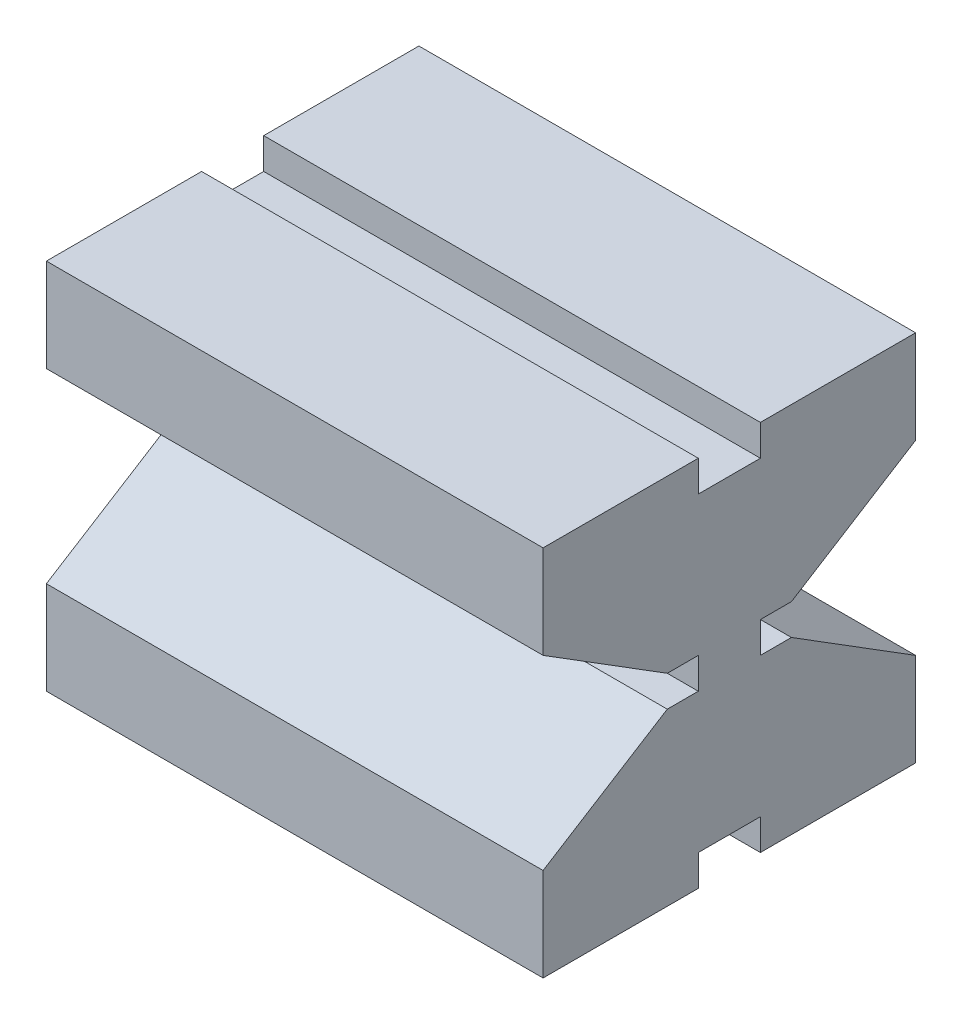
ISO-10303-21;
HEADER;
FILE_DESCRIPTION(('STEP AP214'),'2;1');
FILE_NAME('part.step','',(''),(''),'','','');
FILE_SCHEMA(('AUTOMOTIVE_DESIGN { 1 0 10303 214 1 1 1 1 }'));
ENDSEC;
DATA;
#1=APPLICATION_CONTEXT('core data for automotive mechanical design processes');
#2=APPLICATION_PROTOCOL_DEFINITION('international standard','automotive_design',2000,#1);
#3=PRODUCT_CONTEXT('',#1,'mechanical');
#4=PRODUCT('Part','Part','',(#3));
#5=PRODUCT_RELATED_PRODUCT_CATEGORY('part','',(#4));
#6=PRODUCT_DEFINITION_FORMATION('','',#4);
#7=PRODUCT_DEFINITION_CONTEXT('part definition',#1,'design');
#8=PRODUCT_DEFINITION('design','',#6,#7);
#9=PRODUCT_DEFINITION_SHAPE('','',#8);
#10=(LENGTH_UNIT() NAMED_UNIT(*) SI_UNIT(.MILLI.,.METRE.));
#11=(NAMED_UNIT(*) PLANE_ANGLE_UNIT() SI_UNIT($,.RADIAN.));
#12=(NAMED_UNIT(*) SI_UNIT($,.STERADIAN.) SOLID_ANGLE_UNIT());
#13=UNCERTAINTY_MEASURE_WITH_UNIT(LENGTH_MEASURE(1.E-05),#10,'distance_accuracy_value','');
#14=(GEOMETRIC_REPRESENTATION_CONTEXT(3) GLOBAL_UNCERTAINTY_ASSIGNED_CONTEXT((#13)) GLOBAL_UNIT_ASSIGNED_CONTEXT((#10,
#11,#12)) REPRESENTATION_CONTEXT('',''));
#15=CARTESIAN_POINT('',(0.,0.,0.));
#16=DIRECTION('',(0.,0.,1.));
#17=DIRECTION('',(1.,0.,0.));
#18=AXIS2_PLACEMENT_3D('',#15,#16,#17);
#19=CARTESIAN_POINT('',(-40.,-30.,30.));
#20=DIRECTION('',(0.,-1.,0.));
#21=DIRECTION('',(0.,0.,-1.));
#22=AXIS2_PLACEMENT_3D('',#19,#20,#21);
#23=PLANE('',#22);
#24=DIRECTION('',(0.,0.,-1.));
#25=VECTOR('',#24,1.);
#26=CARTESIAN_POINT('',(40.,-30.,30.));
#27=LINE('',#26,#25);
#28=CARTESIAN_POINT('',(40.,-30.,30.));
#29=VERTEX_POINT('',#28);
#30=CARTESIAN_POINT('',(40.,-30.,5.));
#31=VERTEX_POINT('',#30);
#32=EDGE_CURVE('E232',#29,#31,#27,.T.);
#33=ORIENTED_EDGE('',*,*,#32,.F.);
#34=DIRECTION('',(1.,0.,0.));
#35=VECTOR('',#34,1.);
#36=CARTESIAN_POINT('',(-40.,-30.,30.));
#37=LINE('',#36,#35);
#38=CARTESIAN_POINT('',(-40.,-30.,30.));
#39=VERTEX_POINT('',#38);
#40=EDGE_CURVE('E11',#39,#29,#37,.T.);
#41=ORIENTED_EDGE('',*,*,#40,.F.);
#42=DIRECTION('',(0.,0.,-1.));
#43=VECTOR('',#42,1.);
#44=CARTESIAN_POINT('',(-40.,-30.,30.));
#45=LINE('',#44,#43);
#46=CARTESIAN_POINT('',(-40.,-30.,5.));
#47=VERTEX_POINT('',#46);
#48=EDGE_CURVE('E300',#39,#47,#45,.T.);
#49=ORIENTED_EDGE('',*,*,#48,.T.);
#50=DIRECTION('',(1.,0.,0.));
#51=VECTOR('',#50,1.);
#52=CARTESIAN_POINT('',(-40.,-30.,5.));
#53=LINE('',#52,#51);
#54=EDGE_CURVE('E42',#47,#31,#53,.T.);
#55=ORIENTED_EDGE('',*,*,#54,.T.);
#56=EDGE_LOOP('',(#33,#41,#49,#55));
#57=FACE_BOUND('',#56,.T.);
#58=ADVANCED_FACE('F39',(#57),#23,.T.);
#59=CARTESIAN_POINT('',(-40.,-30.,30.));
#60=DIRECTION('',(0.,0.,1.));
#61=DIRECTION('',(1.,0.,0.));
#62=AXIS2_PLACEMENT_3D('',#59,#60,#61);
#63=PLANE('',#62);
#64=DIRECTION('',(0.,-1.,0.));
#65=VECTOR('',#64,1.);
#66=CARTESIAN_POINT('',(40.,-30.,30.));
#67=LINE('',#66,#65);
#68=CARTESIAN_POINT('',(40.,-15.,30.));
#69=VERTEX_POINT('',#68);
#70=EDGE_CURVE('E298',#69,#29,#67,.T.);
#71=ORIENTED_EDGE('',*,*,#70,.F.);
#72=DIRECTION('',(1.,0.,0.));
#73=VECTOR('',#72,1.);
#74=CARTESIAN_POINT('',(-40.,-15.,30.));
#75=LINE('',#74,#73);
#76=CARTESIAN_POINT('',(-40.,-15.,30.));
#77=VERTEX_POINT('',#76);
#78=EDGE_CURVE('E48',#77,#69,#75,.T.);
#79=ORIENTED_EDGE('',*,*,#78,.F.);
#80=DIRECTION('',(0.,-1.,0.));
#81=VECTOR('',#80,1.);
#82=CARTESIAN_POINT('',(-40.,-30.,30.));
#83=LINE('',#82,#81);
#84=EDGE_CURVE('E222',#77,#39,#83,.T.);
#85=ORIENTED_EDGE('',*,*,#84,.T.);
#86=ORIENTED_EDGE('',*,*,#40,.T.);
#87=EDGE_LOOP('',(#71,#79,#85,#86));
#88=FACE_BOUND('',#87,.T.);
#89=ADVANCED_FACE('F344',(#88),#63,.T.);
#90=CARTESIAN_POINT('',(-40.,-15.,30.));
#91=DIRECTION('',(0.,0.847998304005088,0.52999894000318));
#92=DIRECTION('',(0.,-0.52999894000318,0.847998304005088));
#93=AXIS2_PLACEMENT_3D('',#90,#91,#92);
#94=PLANE('',#93);
#95=DIRECTION('',(0.,-0.52999894000318,0.847998304005088));
#96=VECTOR('',#95,1.);
#97=CARTESIAN_POINT('',(40.,-15.,30.));
#98=LINE('',#97,#96);
#99=CARTESIAN_POINT('',(40.,-2.49999999999999,10.));
#100=VERTEX_POINT('',#99);
#101=EDGE_CURVE('E209',#100,#69,#98,.T.);
#102=ORIENTED_EDGE('',*,*,#101,.F.);
#103=DIRECTION('',(1.,0.,0.));
#104=VECTOR('',#103,1.);
#105=CARTESIAN_POINT('',(-40.,-2.49999999999999,10.));
#106=LINE('',#105,#104);
#107=CARTESIAN_POINT('',(-40.,-2.49999999999999,10.));
#108=VERTEX_POINT('',#107);
#109=EDGE_CURVE('E204',#108,#100,#106,.T.);
#110=ORIENTED_EDGE('',*,*,#109,.F.);
#111=DIRECTION('',(0.,-0.52999894000318,0.847998304005088));
#112=VECTOR('',#111,1.);
#113=CARTESIAN_POINT('',(-40.,-15.,30.));
#114=LINE('',#113,#112);
#115=EDGE_CURVE('E207',#108,#77,#114,.T.);
#116=ORIENTED_EDGE('',*,*,#115,.T.);
#117=ORIENTED_EDGE('',*,*,#78,.T.);
#118=EDGE_LOOP('',(#102,#110,#116,#117));
#119=FACE_BOUND('',#118,.T.);
#120=ADVANCED_FACE('F206',(#119),#94,.T.);
#121=CARTESIAN_POINT('',(-40.,-2.49999999999999,10.));
#122=DIRECTION('',(0.,1.,0.));
#123=DIRECTION('',(0.,0.,1.));
#124=AXIS2_PLACEMENT_3D('',#121,#122,#123);
#125=PLANE('',#124);
#126=DIRECTION('',(0.,0.,1.));
#127=VECTOR('',#126,1.);
#128=CARTESIAN_POINT('',(40.,-2.49999999999999,10.));
#129=LINE('',#128,#127);
#130=CARTESIAN_POINT('',(40.,-2.49999999999999,5.));
#131=VERTEX_POINT('',#130);
#132=EDGE_CURVE('E295',#131,#100,#129,.T.);
#133=ORIENTED_EDGE('',*,*,#132,.F.);
#134=DIRECTION('',(1.,0.,0.));
#135=VECTOR('',#134,1.);
#136=CARTESIAN_POINT('',(-40.,-2.49999999999999,5.));
#137=LINE('',#136,#135);
#138=CARTESIAN_POINT('',(-40.,-2.49999999999999,5.));
#139=VERTEX_POINT('',#138);
#140=EDGE_CURVE('E214',#139,#131,#137,.T.);
#141=ORIENTED_EDGE('',*,*,#140,.F.);
#142=DIRECTION('',(0.,0.,1.));
#143=VECTOR('',#142,1.);
#144=CARTESIAN_POINT('',(-40.,-2.49999999999999,10.));
#145=LINE('',#144,#143);
#146=EDGE_CURVE('E220',#139,#108,#145,.T.);
#147=ORIENTED_EDGE('',*,*,#146,.T.);
#148=ORIENTED_EDGE('',*,*,#109,.T.);
#149=EDGE_LOOP('',(#133,#141,#147,#148));
#150=FACE_BOUND('',#149,.T.);
#151=ADVANCED_FACE('F224',(#150),#125,.T.);
#152=CARTESIAN_POINT('',(-40.,-2.49999999999999,5.));
#153=DIRECTION('',(0.,0.,1.));
#154=DIRECTION('',(0.,-1.,0.));
#155=AXIS2_PLACEMENT_3D('',#152,#153,#154);
#156=PLANE('',#155);
#157=DIRECTION('',(0.,-1.,0.));
#158=VECTOR('',#157,1.);
#159=CARTESIAN_POINT('',(40.,-2.49999999999999,5.));
#160=LINE('',#159,#158);
#161=CARTESIAN_POINT('',(40.,2.50000000000001,5.));
#162=VERTEX_POINT('',#161);
#163=EDGE_CURVE('E292',#162,#131,#160,.T.);
#164=ORIENTED_EDGE('',*,*,#163,.F.);
#165=DIRECTION('',(1.,0.,0.));
#166=VECTOR('',#165,1.);
#167=CARTESIAN_POINT('',(-40.,2.50000000000001,5.));
#168=LINE('',#167,#166);
#169=CARTESIAN_POINT('',(-40.,2.50000000000001,5.));
#170=VERTEX_POINT('',#169);
#171=EDGE_CURVE('E304',#170,#162,#168,.T.);
#172=ORIENTED_EDGE('',*,*,#171,.F.);
#173=DIRECTION('',(0.,-1.,0.));
#174=VECTOR('',#173,1.);
#175=CARTESIAN_POINT('',(-40.,-2.49999999999999,5.));
#176=LINE('',#175,#174);
#177=EDGE_CURVE('E225',#170,#139,#176,.T.);
#178=ORIENTED_EDGE('',*,*,#177,.T.);
#179=ORIENTED_EDGE('',*,*,#140,.T.);
#180=EDGE_LOOP('',(#164,#172,#178,#179));
#181=FACE_BOUND('',#180,.T.);
#182=ADVANCED_FACE('F357',(#181),#156,.T.);
#183=CARTESIAN_POINT('',(-40.,2.50000000000001,10.));
#184=DIRECTION('',(0.,-1.,0.));
#185=DIRECTION('',(0.,0.,-1.));
#186=AXIS2_PLACEMENT_3D('',#183,#184,#185);
#187=PLANE('',#186);
#188=DIRECTION('',(0.,0.,-1.));
#189=VECTOR('',#188,1.);
#190=CARTESIAN_POINT('',(40.,2.50000000000001,10.));
#191=LINE('',#190,#189);
#192=CARTESIAN_POINT('',(40.,2.50000000000001,10.));
#193=VERTEX_POINT('',#192);
#194=EDGE_CURVE('E289',#193,#162,#191,.T.);
#195=ORIENTED_EDGE('',*,*,#194,.F.);
#196=DIRECTION('',(1.,0.,0.));
#197=VECTOR('',#196,1.);
#198=CARTESIAN_POINT('',(-40.,2.50000000000001,10.));
#199=LINE('',#198,#197);
#200=CARTESIAN_POINT('',(-40.,2.50000000000001,10.));
#201=VERTEX_POINT('',#200);
#202=EDGE_CURVE('E306',#201,#193,#199,.T.);
#203=ORIENTED_EDGE('',*,*,#202,.F.);
#204=DIRECTION('',(0.,0.,-1.));
#205=VECTOR('',#204,1.);
#206=CARTESIAN_POINT('',(-40.,2.50000000000001,10.));
#207=LINE('',#206,#205);
#208=EDGE_CURVE('E227',#201,#170,#207,.T.);
#209=ORIENTED_EDGE('',*,*,#208,.T.);
#210=ORIENTED_EDGE('',*,*,#171,.T.);
#211=EDGE_LOOP('',(#195,#203,#209,#210));
#212=FACE_BOUND('',#211,.T.);
#213=ADVANCED_FACE('F360',(#212),#187,.T.);
#214=CARTESIAN_POINT('',(-40.,15.,30.));
#215=DIRECTION('',(0.,-0.847998304005088,0.52999894000318));
#216=DIRECTION('',(0.,-0.52999894000318,-0.847998304005088));
#217=AXIS2_PLACEMENT_3D('',#214,#215,#216);
#218=PLANE('',#217);
#219=DIRECTION('',(0.,-0.52999894000318,-0.847998304005088));
#220=VECTOR('',#219,1.);
#221=CARTESIAN_POINT('',(40.,15.,30.));
#222=LINE('',#221,#220);
#223=CARTESIAN_POINT('',(40.,15.,30.));
#224=VERTEX_POINT('',#223);
#225=EDGE_CURVE('E286',#224,#193,#222,.T.);
#226=ORIENTED_EDGE('',*,*,#225,.F.);
#227=DIRECTION('',(1.,0.,0.));
#228=VECTOR('',#227,1.);
#229=CARTESIAN_POINT('',(-40.,15.,30.));
#230=LINE('',#229,#228);
#231=CARTESIAN_POINT('',(-40.,15.,30.));
#232=VERTEX_POINT('',#231);
#233=EDGE_CURVE('E308',#232,#224,#230,.T.);
#234=ORIENTED_EDGE('',*,*,#233,.F.);
#235=DIRECTION('',(0.,-0.52999894000318,-0.847998304005088));
#236=VECTOR('',#235,1.);
#237=CARTESIAN_POINT('',(-40.,15.,30.));
#238=LINE('',#237,#236);
#239=EDGE_CURVE('E650',#232,#201,#238,.T.);
#240=ORIENTED_EDGE('',*,*,#239,.T.);
#241=ORIENTED_EDGE('',*,*,#202,.T.);
#242=EDGE_LOOP('',(#226,#234,#240,#241));
#243=FACE_BOUND('',#242,.T.);
#244=ADVANCED_FACE('F364',(#243),#218,.T.);
#245=CARTESIAN_POINT('',(-40.,30.,30.));
#246=DIRECTION('',(0.,0.,1.));
#247=DIRECTION('',(0.,-1.,0.));
#248=AXIS2_PLACEMENT_3D('',#245,#246,#247);
#249=PLANE('',#248);
#250=DIRECTION('',(0.,-1.,0.));
#251=VECTOR('',#250,1.);
#252=CARTESIAN_POINT('',(40.,30.,30.));
#253=LINE('',#252,#251);
#254=CARTESIAN_POINT('',(40.,30.,30.));
#255=VERTEX_POINT('',#254);
#256=EDGE_CURVE('E283',#255,#224,#253,.T.);
#257=ORIENTED_EDGE('',*,*,#256,.F.);
#258=DIRECTION('',(1.,0.,0.));
#259=VECTOR('',#258,1.);
#260=CARTESIAN_POINT('',(-40.,30.,30.));
#261=LINE('',#260,#259);
#262=CARTESIAN_POINT('',(-40.,30.,30.));
#263=VERTEX_POINT('',#262);
#264=EDGE_CURVE('E310',#263,#255,#261,.T.);
#265=ORIENTED_EDGE('',*,*,#264,.F.);
#266=DIRECTION('',(0.,-1.,0.));
#267=VECTOR('',#266,1.);
#268=CARTESIAN_POINT('',(-40.,30.,30.));
#269=LINE('',#268,#267);
#270=EDGE_CURVE('E654',#263,#232,#269,.T.);
#271=ORIENTED_EDGE('',*,*,#270,.T.);
#272=ORIENTED_EDGE('',*,*,#233,.T.);
#273=EDGE_LOOP('',(#257,#265,#271,#272));
#274=FACE_BOUND('',#273,.T.);
#275=ADVANCED_FACE('F368',(#274),#249,.T.);
#276=CARTESIAN_POINT('',(-40.,30.,30.));
#277=DIRECTION('',(0.,1.,0.));
#278=DIRECTION('',(0.,0.,1.));
#279=AXIS2_PLACEMENT_3D('',#276,#277,#278);
#280=PLANE('',#279);
#281=DIRECTION('',(0.,0.,1.));
#282=VECTOR('',#281,1.);
#283=CARTESIAN_POINT('',(40.,30.,30.));
#284=LINE('',#283,#282);
#285=CARTESIAN_POINT('',(40.,30.,5.));
#286=VERTEX_POINT('',#285);
#287=EDGE_CURVE('E280',#286,#255,#284,.T.);
#288=ORIENTED_EDGE('',*,*,#287,.F.);
#289=DIRECTION('',(1.,0.,0.));
#290=VECTOR('',#289,1.);
#291=CARTESIAN_POINT('',(-40.,30.,5.));
#292=LINE('',#291,#290);
#293=CARTESIAN_POINT('',(-40.,30.,5.));
#294=VERTEX_POINT('',#293);
#295=EDGE_CURVE('E312',#294,#286,#292,.T.);
#296=ORIENTED_EDGE('',*,*,#295,.F.);
#297=DIRECTION('',(0.,0.,1.));
#298=VECTOR('',#297,1.);
#299=CARTESIAN_POINT('',(-40.,30.,30.));
#300=LINE('',#299,#298);
#301=EDGE_CURVE('E643',#294,#263,#300,.T.);
#302=ORIENTED_EDGE('',*,*,#301,.T.);
#303=ORIENTED_EDGE('',*,*,#264,.T.);
#304=EDGE_LOOP('',(#288,#296,#302,#303));
#305=FACE_BOUND('',#304,.T.);
#306=ADVANCED_FACE('F372',(#305),#280,.T.);
#307=CARTESIAN_POINT('',(-40.,30.,5.));
#308=DIRECTION('',(0.,0.,-1.));
#309=DIRECTION('',(0.,1.,0.));
#310=AXIS2_PLACEMENT_3D('',#307,#308,#309);
#311=PLANE('',#310);
#312=DIRECTION('',(0.,1.,0.));
#313=VECTOR('',#312,1.);
#314=CARTESIAN_POINT('',(40.,30.,5.));
#315=LINE('',#314,#313);
#316=CARTESIAN_POINT('',(40.,25.,5.00000000000001));
#317=VERTEX_POINT('',#316);
#318=EDGE_CURVE('E277',#317,#286,#315,.T.);
#319=ORIENTED_EDGE('',*,*,#318,.F.);
#320=DIRECTION('',(1.,0.,0.));
#321=VECTOR('',#320,1.);
#322=CARTESIAN_POINT('',(-40.,25.,5.00000000000001));
#323=LINE('',#322,#321);
#324=CARTESIAN_POINT('',(-40.,25.,5.00000000000001));
#325=VERTEX_POINT('',#324);
#326=EDGE_CURVE('E314',#325,#317,#323,.T.);
#327=ORIENTED_EDGE('',*,*,#326,.F.);
#328=DIRECTION('',(0.,1.,0.));
#329=VECTOR('',#328,1.);
#330=CARTESIAN_POINT('',(-40.,30.,5.));
#331=LINE('',#330,#329);
#332=EDGE_CURVE('E639',#325,#294,#331,.T.);
#333=ORIENTED_EDGE('',*,*,#332,.T.);
#334=ORIENTED_EDGE('',*,*,#295,.T.);
#335=EDGE_LOOP('',(#319,#327,#333,#334));
#336=FACE_BOUND('',#335,.T.);
#337=ADVANCED_FACE('F376',(#336),#311,.T.);
#338=CARTESIAN_POINT('',(-40.,25.,5.00000000000001));
#339=DIRECTION('',(0.,1.,0.));
#340=DIRECTION('',(0.,0.,1.));
#341=AXIS2_PLACEMENT_3D('',#338,#339,#340);
#342=PLANE('',#341);
#343=DIRECTION('',(0.,0.,1.));
#344=VECTOR('',#343,1.);
#345=CARTESIAN_POINT('',(40.,25.,5.00000000000001));
#346=LINE('',#345,#344);
#347=CARTESIAN_POINT('',(40.,25.,-4.99999999999999));
#348=VERTEX_POINT('',#347);
#349=EDGE_CURVE('E274',#348,#317,#346,.T.);
#350=ORIENTED_EDGE('',*,*,#349,.F.);
#351=DIRECTION('',(1.,0.,0.));
#352=VECTOR('',#351,1.);
#353=CARTESIAN_POINT('',(-40.,25.,-4.99999999999999));
#354=LINE('',#353,#352);
#355=CARTESIAN_POINT('',(-40.,25.,-4.99999999999999));
#356=VERTEX_POINT('',#355);
#357=EDGE_CURVE('E316',#356,#348,#354,.T.);
#358=ORIENTED_EDGE('',*,*,#357,.F.);
#359=DIRECTION('',(0.,0.,1.));
#360=VECTOR('',#359,1.);
#361=CARTESIAN_POINT('',(-40.,25.,5.00000000000001));
#362=LINE('',#361,#360);
#363=EDGE_CURVE('E660',#356,#325,#362,.T.);
#364=ORIENTED_EDGE('',*,*,#363,.T.);
#365=ORIENTED_EDGE('',*,*,#326,.T.);
#366=EDGE_LOOP('',(#350,#358,#364,#365));
#367=FACE_BOUND('',#366,.T.);
#368=ADVANCED_FACE('F380',(#367),#342,.T.);
#369=CARTESIAN_POINT('',(-40.,30.,-4.99999999999999));
#370=DIRECTION('',(0.,0.,1.));
#371=DIRECTION('',(0.,-1.,0.));
#372=AXIS2_PLACEMENT_3D('',#369,#370,#371);
#373=PLANE('',#372);
#374=DIRECTION('',(0.,-1.,0.));
#375=VECTOR('',#374,1.);
#376=CARTESIAN_POINT('',(40.,30.,-4.99999999999999));
#377=LINE('',#376,#375);
#378=CARTESIAN_POINT('',(40.,30.,-4.99999999999999));
#379=VERTEX_POINT('',#378);
#380=EDGE_CURVE('E271',#379,#348,#377,.T.);
#381=ORIENTED_EDGE('',*,*,#380,.F.);
#382=DIRECTION('',(1.,0.,0.));
#383=VECTOR('',#382,1.);
#384=CARTESIAN_POINT('',(-40.,30.,-4.99999999999999));
#385=LINE('',#384,#383);
#386=CARTESIAN_POINT('',(-40.,30.,-4.99999999999999));
#387=VERTEX_POINT('',#386);
#388=EDGE_CURVE('E318',#387,#379,#385,.T.);
#389=ORIENTED_EDGE('',*,*,#388,.F.);
#390=DIRECTION('',(0.,-1.,0.));
#391=VECTOR('',#390,1.);
#392=CARTESIAN_POINT('',(-40.,30.,-4.99999999999999));
#393=LINE('',#392,#391);
#394=EDGE_CURVE('E632',#387,#356,#393,.T.);
#395=ORIENTED_EDGE('',*,*,#394,.T.);
#396=ORIENTED_EDGE('',*,*,#357,.T.);
#397=EDGE_LOOP('',(#381,#389,#395,#396));
#398=FACE_BOUND('',#397,.T.);
#399=ADVANCED_FACE('F384',(#398),#373,.T.);
#400=CARTESIAN_POINT('',(-40.,30.,-30.));
#401=DIRECTION('',(0.,1.,0.));
#402=DIRECTION('',(0.,0.,1.));
#403=AXIS2_PLACEMENT_3D('',#400,#401,#402);
#404=PLANE('',#403);
#405=DIRECTION('',(0.,0.,1.));
#406=VECTOR('',#405,1.);
#407=CARTESIAN_POINT('',(40.,30.,-30.));
#408=LINE('',#407,#406);
#409=CARTESIAN_POINT('',(40.,30.,-30.));
#410=VERTEX_POINT('',#409);
#411=EDGE_CURVE('E268',#410,#379,#408,.T.);
#412=ORIENTED_EDGE('',*,*,#411,.F.);
#413=DIRECTION('',(1.,0.,0.));
#414=VECTOR('',#413,1.);
#415=CARTESIAN_POINT('',(-40.,30.,-30.));
#416=LINE('',#415,#414);
#417=CARTESIAN_POINT('',(-40.,30.,-30.));
#418=VERTEX_POINT('',#417);
#419=EDGE_CURVE('E320',#418,#410,#416,.T.);
#420=ORIENTED_EDGE('',*,*,#419,.F.);
#421=DIRECTION('',(0.,0.,1.));
#422=VECTOR('',#421,1.);
#423=CARTESIAN_POINT('',(-40.,30.,-30.));
#424=LINE('',#423,#422);
#425=EDGE_CURVE('E628',#418,#387,#424,.T.);
#426=ORIENTED_EDGE('',*,*,#425,.T.);
#427=ORIENTED_EDGE('',*,*,#388,.T.);
#428=EDGE_LOOP('',(#412,#420,#426,#427));
#429=FACE_BOUND('',#428,.T.);
#430=ADVANCED_FACE('F388',(#429),#404,.T.);
#431=CARTESIAN_POINT('',(-40.,30.,-30.));
#432=DIRECTION('',(0.,0.,-1.));
#433=DIRECTION('',(0.,1.,0.));
#434=AXIS2_PLACEMENT_3D('',#431,#432,#433);
#435=PLANE('',#434);
#436=DIRECTION('',(0.,1.,0.));
#437=VECTOR('',#436,1.);
#438=CARTESIAN_POINT('',(40.,30.,-30.));
#439=LINE('',#438,#437);
#440=CARTESIAN_POINT('',(40.,15.,-30.));
#441=VERTEX_POINT('',#440);
#442=EDGE_CURVE('E265',#441,#410,#439,.T.);
#443=ORIENTED_EDGE('',*,*,#442,.F.);
#444=DIRECTION('',(1.,0.,0.));
#445=VECTOR('',#444,1.);
#446=CARTESIAN_POINT('',(-40.,15.,-30.));
#447=LINE('',#446,#445);
#448=CARTESIAN_POINT('',(-40.,15.,-30.));
#449=VERTEX_POINT('',#448);
#450=EDGE_CURVE('E322',#449,#441,#447,.T.);
#451=ORIENTED_EDGE('',*,*,#450,.F.);
#452=DIRECTION('',(0.,1.,0.));
#453=VECTOR('',#452,1.);
#454=CARTESIAN_POINT('',(-40.,30.,-30.));
#455=LINE('',#454,#453);
#456=EDGE_CURVE('E664',#449,#418,#455,.T.);
#457=ORIENTED_EDGE('',*,*,#456,.T.);
#458=ORIENTED_EDGE('',*,*,#419,.T.);
#459=EDGE_LOOP('',(#443,#451,#457,#458));
#460=FACE_BOUND('',#459,.T.);
#461=ADVANCED_FACE('F392',(#460),#435,.T.);
#462=CARTESIAN_POINT('',(-40.,15.,-30.));
#463=DIRECTION('',(0.,-0.847998304005088,-0.529998940003179));
#464=DIRECTION('',(0.,0.52999894000318,-0.847998304005088));
#465=AXIS2_PLACEMENT_3D('',#462,#463,#464);
#466=PLANE('',#465);
#467=DIRECTION('',(0.,0.529998940003179,-0.847998304005088));
#468=VECTOR('',#467,1.);
#469=CARTESIAN_POINT('',(40.,15.,-30.));
#470=LINE('',#469,#468);
#471=CARTESIAN_POINT('',(40.,2.50000000000002,-10.));
#472=VERTEX_POINT('',#471);
#473=EDGE_CURVE('E262',#472,#441,#470,.T.);
#474=ORIENTED_EDGE('',*,*,#473,.F.);
#475=DIRECTION('',(1.,0.,0.));
#476=VECTOR('',#475,1.);
#477=CARTESIAN_POINT('',(-40.,2.50000000000002,-10.));
#478=LINE('',#477,#476);
#479=CARTESIAN_POINT('',(-40.,2.50000000000002,-10.));
#480=VERTEX_POINT('',#479);
#481=EDGE_CURVE('E324',#480,#472,#478,.T.);
#482=ORIENTED_EDGE('',*,*,#481,.F.);
#483=DIRECTION('',(0.,0.529998940003179,-0.847998304005088));
#484=VECTOR('',#483,1.);
#485=CARTESIAN_POINT('',(-40.,15.,-30.));
#486=LINE('',#485,#484);
#487=EDGE_CURVE('E621',#480,#449,#486,.T.);
#488=ORIENTED_EDGE('',*,*,#487,.T.);
#489=ORIENTED_EDGE('',*,*,#450,.T.);
#490=EDGE_LOOP('',(#474,#482,#488,#489));
#491=FACE_BOUND('',#490,.T.);
#492=ADVANCED_FACE('F396',(#491),#466,.T.);
#493=CARTESIAN_POINT('',(-40.,2.50000000000002,-10.));
#494=DIRECTION('',(0.,-1.,0.));
#495=DIRECTION('',(0.,0.,-1.));
#496=AXIS2_PLACEMENT_3D('',#493,#494,#495);
#497=PLANE('',#496);
#498=DIRECTION('',(0.,0.,-1.));
#499=VECTOR('',#498,1.);
#500=CARTESIAN_POINT('',(40.,2.50000000000002,-10.));
#501=LINE('',#500,#499);
#502=CARTESIAN_POINT('',(40.,2.50000000000001,-5.));
#503=VERTEX_POINT('',#502);
#504=EDGE_CURVE('E259',#503,#472,#501,.T.);
#505=ORIENTED_EDGE('',*,*,#504,.F.);
#506=DIRECTION('',(1.,0.,0.));
#507=VECTOR('',#506,1.);
#508=CARTESIAN_POINT('',(-40.,2.50000000000001,-5.));
#509=LINE('',#508,#507);
#510=CARTESIAN_POINT('',(-40.,2.50000000000001,-5.));
#511=VERTEX_POINT('',#510);
#512=EDGE_CURVE('E326',#511,#503,#509,.T.);
#513=ORIENTED_EDGE('',*,*,#512,.F.);
#514=DIRECTION('',(0.,0.,-1.));
#515=VECTOR('',#514,1.);
#516=CARTESIAN_POINT('',(-40.,2.50000000000002,-10.));
#517=LINE('',#516,#515);
#518=EDGE_CURVE('E617',#511,#480,#517,.T.);
#519=ORIENTED_EDGE('',*,*,#518,.T.);
#520=ORIENTED_EDGE('',*,*,#481,.T.);
#521=EDGE_LOOP('',(#505,#513,#519,#520));
#522=FACE_BOUND('',#521,.T.);
#523=ADVANCED_FACE('F400',(#522),#497,.T.);
#524=CARTESIAN_POINT('',(-40.,-2.49999999999999,-5.));
#525=DIRECTION('',(0.,0.,-1.));
#526=DIRECTION('',(0.,1.,0.));
#527=AXIS2_PLACEMENT_3D('',#524,#525,#526);
#528=PLANE('',#527);
#529=DIRECTION('',(0.,1.,0.));
#530=VECTOR('',#529,1.);
#531=CARTESIAN_POINT('',(40.,-2.49999999999999,-5.));
#532=LINE('',#531,#530);
#533=CARTESIAN_POINT('',(40.,-2.49999999999999,-5.));
#534=VERTEX_POINT('',#533);
#535=EDGE_CURVE('E256',#534,#503,#532,.T.);
#536=ORIENTED_EDGE('',*,*,#535,.F.);
#537=DIRECTION('',(1.,0.,0.));
#538=VECTOR('',#537,1.);
#539=CARTESIAN_POINT('',(-40.,-2.49999999999999,-5.));
#540=LINE('',#539,#538);
#541=CARTESIAN_POINT('',(-40.,-2.49999999999999,-5.));
#542=VERTEX_POINT('',#541);
#543=EDGE_CURVE('E328',#542,#534,#540,.T.);
#544=ORIENTED_EDGE('',*,*,#543,.F.);
#545=DIRECTION('',(0.,1.,0.));
#546=VECTOR('',#545,1.);
#547=CARTESIAN_POINT('',(-40.,-2.49999999999999,-5.));
#548=LINE('',#547,#546);
#549=EDGE_CURVE('E668',#542,#511,#548,.T.);
#550=ORIENTED_EDGE('',*,*,#549,.T.);
#551=ORIENTED_EDGE('',*,*,#512,.T.);
#552=EDGE_LOOP('',(#536,#544,#550,#551));
#553=FACE_BOUND('',#552,.T.);
#554=ADVANCED_FACE('F404',(#553),#528,.T.);
#555=CARTESIAN_POINT('',(-40.,-2.49999999999999,-10.));
#556=DIRECTION('',(0.,1.,0.));
#557=DIRECTION('',(0.,0.,1.));
#558=AXIS2_PLACEMENT_3D('',#555,#556,#557);
#559=PLANE('',#558);
#560=DIRECTION('',(0.,0.,1.));
#561=VECTOR('',#560,1.);
#562=CARTESIAN_POINT('',(40.,-2.49999999999999,-10.));
#563=LINE('',#562,#561);
#564=CARTESIAN_POINT('',(40.,-2.49999999999999,-10.));
#565=VERTEX_POINT('',#564);
#566=EDGE_CURVE('E253',#565,#534,#563,.T.);
#567=ORIENTED_EDGE('',*,*,#566,.F.);
#568=DIRECTION('',(1.,0.,0.));
#569=VECTOR('',#568,1.);
#570=CARTESIAN_POINT('',(-40.,-2.49999999999999,-10.));
#571=LINE('',#570,#569);
#572=CARTESIAN_POINT('',(-40.,-2.49999999999999,-10.));
#573=VERTEX_POINT('',#572);
#574=EDGE_CURVE('E330',#573,#565,#571,.T.);
#575=ORIENTED_EDGE('',*,*,#574,.F.);
#576=DIRECTION('',(0.,0.,1.));
#577=VECTOR('',#576,1.);
#578=CARTESIAN_POINT('',(-40.,-2.49999999999999,-10.));
#579=LINE('',#578,#577);
#580=EDGE_CURVE('E610',#573,#542,#579,.T.);
#581=ORIENTED_EDGE('',*,*,#580,.T.);
#582=ORIENTED_EDGE('',*,*,#543,.T.);
#583=EDGE_LOOP('',(#567,#575,#581,#582));
#584=FACE_BOUND('',#583,.T.);
#585=ADVANCED_FACE('F408',(#584),#559,.T.);
#586=CARTESIAN_POINT('',(-40.,-15.,-30.));
#587=DIRECTION('',(0.,0.847998304005088,-0.52999894000318));
#588=DIRECTION('',(0.,0.52999894000318,0.847998304005088));
#589=AXIS2_PLACEMENT_3D('',#586,#587,#588);
#590=PLANE('',#589);
#591=DIRECTION('',(0.,0.52999894000318,0.847998304005088));
#592=VECTOR('',#591,1.);
#593=CARTESIAN_POINT('',(40.,-15.,-30.));
#594=LINE('',#593,#592);
#595=CARTESIAN_POINT('',(40.,-15.,-30.));
#596=VERTEX_POINT('',#595);
#597=EDGE_CURVE('E250',#596,#565,#594,.T.);
#598=ORIENTED_EDGE('',*,*,#597,.F.);
#599=DIRECTION('',(1.,0.,0.));
#600=VECTOR('',#599,1.);
#601=CARTESIAN_POINT('',(-40.,-15.,-30.));
#602=LINE('',#601,#600);
#603=CARTESIAN_POINT('',(-40.,-15.,-30.));
#604=VERTEX_POINT('',#603);
#605=EDGE_CURVE('E332',#604,#596,#602,.T.);
#606=ORIENTED_EDGE('',*,*,#605,.F.);
#607=DIRECTION('',(0.,0.52999894000318,0.847998304005088));
#608=VECTOR('',#607,1.);
#609=CARTESIAN_POINT('',(-40.,-15.,-30.));
#610=LINE('',#609,#608);
#611=EDGE_CURVE('E606',#604,#573,#610,.T.);
#612=ORIENTED_EDGE('',*,*,#611,.T.);
#613=ORIENTED_EDGE('',*,*,#574,.T.);
#614=EDGE_LOOP('',(#598,#606,#612,#613));
#615=FACE_BOUND('',#614,.T.);
#616=ADVANCED_FACE('F412',(#615),#590,.T.);
#617=CARTESIAN_POINT('',(-40.,-30.,-30.));
#618=DIRECTION('',(0.,0.,-1.));
#619=DIRECTION('',(-1.,0.,0.));
#620=AXIS2_PLACEMENT_3D('',#617,#618,#619);
#621=PLANE('',#620);
#622=DIRECTION('',(0.,1.,0.));
#623=VECTOR('',#622,1.);
#624=CARTESIAN_POINT('',(40.,-30.,-30.));
#625=LINE('',#624,#623);
#626=CARTESIAN_POINT('',(40.,-30.,-30.));
#627=VERTEX_POINT('',#626);
#628=EDGE_CURVE('E247',#627,#596,#625,.T.);
#629=ORIENTED_EDGE('',*,*,#628,.F.);
#630=DIRECTION('',(1.,0.,0.));
#631=VECTOR('',#630,1.);
#632=CARTESIAN_POINT('',(-40.,-30.,-30.));
#633=LINE('',#632,#631);
#634=CARTESIAN_POINT('',(-40.,-30.,-30.));
#635=VERTEX_POINT('',#634);
#636=EDGE_CURVE('E334',#635,#627,#633,.T.);
#637=ORIENTED_EDGE('',*,*,#636,.F.);
#638=DIRECTION('',(0.,1.,0.));
#639=VECTOR('',#638,1.);
#640=CARTESIAN_POINT('',(-40.,-30.,-30.));
#641=LINE('',#640,#639);
#642=EDGE_CURVE('E672',#635,#604,#641,.T.);
#643=ORIENTED_EDGE('',*,*,#642,.T.);
#644=ORIENTED_EDGE('',*,*,#605,.T.);
#645=EDGE_LOOP('',(#629,#637,#643,#644));
#646=FACE_BOUND('',#645,.T.);
#647=ADVANCED_FACE('F416',(#646),#621,.T.);
#648=CARTESIAN_POINT('',(-40.,-30.,-30.));
#649=DIRECTION('',(0.,-1.,0.));
#650=DIRECTION('',(0.,0.,-1.));
#651=AXIS2_PLACEMENT_3D('',#648,#649,#650);
#652=PLANE('',#651);
#653=DIRECTION('',(0.,0.,-1.));
#654=VECTOR('',#653,1.);
#655=CARTESIAN_POINT('',(40.,-30.,-30.));
#656=LINE('',#655,#654);
#657=CARTESIAN_POINT('',(40.,-30.,-5.));
#658=VERTEX_POINT('',#657);
#659=EDGE_CURVE('E244',#658,#627,#656,.T.);
#660=ORIENTED_EDGE('',*,*,#659,.F.);
#661=DIRECTION('',(1.,0.,0.));
#662=VECTOR('',#661,1.);
#663=CARTESIAN_POINT('',(-40.,-30.,-5.));
#664=LINE('',#663,#662);
#665=CARTESIAN_POINT('',(-40.,-30.,-5.));
#666=VERTEX_POINT('',#665);
#667=EDGE_CURVE('E336',#666,#658,#664,.T.);
#668=ORIENTED_EDGE('',*,*,#667,.F.);
#669=DIRECTION('',(0.,0.,-1.));
#670=VECTOR('',#669,1.);
#671=CARTESIAN_POINT('',(-40.,-30.,-30.));
#672=LINE('',#671,#670);
#673=EDGE_CURVE('E599',#666,#635,#672,.T.);
#674=ORIENTED_EDGE('',*,*,#673,.T.);
#675=ORIENTED_EDGE('',*,*,#636,.T.);
#676=EDGE_LOOP('',(#660,#668,#674,#675));
#677=FACE_BOUND('',#676,.T.);
#678=ADVANCED_FACE('F420',(#677),#652,.T.);
#679=CARTESIAN_POINT('',(-40.,-30.,-5.));
#680=DIRECTION('',(0.,0.,1.));
#681=DIRECTION('',(0.,-1.,0.));
#682=AXIS2_PLACEMENT_3D('',#679,#680,#681);
#683=PLANE('',#682);
#684=DIRECTION('',(0.,-1.,0.));
#685=VECTOR('',#684,1.);
#686=CARTESIAN_POINT('',(40.,-30.,-5.));
#687=LINE('',#686,#685);
#688=CARTESIAN_POINT('',(40.,-25.,-5.));
#689=VERTEX_POINT('',#688);
#690=EDGE_CURVE('E241',#689,#658,#687,.T.);
#691=ORIENTED_EDGE('',*,*,#690,.F.);
#692=DIRECTION('',(1.,0.,0.));
#693=VECTOR('',#692,1.);
#694=CARTESIAN_POINT('',(-40.,-25.,-5.));
#695=LINE('',#694,#693);
#696=CARTESIAN_POINT('',(-40.,-25.,-5.));
#697=VERTEX_POINT('',#696);
#698=EDGE_CURVE('E338',#697,#689,#695,.T.);
#699=ORIENTED_EDGE('',*,*,#698,.F.);
#700=DIRECTION('',(0.,-1.,0.));
#701=VECTOR('',#700,1.);
#702=CARTESIAN_POINT('',(-40.,-30.,-5.));
#703=LINE('',#702,#701);
#704=EDGE_CURVE('E595',#697,#666,#703,.T.);
#705=ORIENTED_EDGE('',*,*,#704,.T.);
#706=ORIENTED_EDGE('',*,*,#667,.T.);
#707=EDGE_LOOP('',(#691,#699,#705,#706));
#708=FACE_BOUND('',#707,.T.);
#709=ADVANCED_FACE('F424',(#708),#683,.T.);
#710=CARTESIAN_POINT('',(-40.,-25.,5.));
#711=DIRECTION('',(0.,-1.,0.));
#712=DIRECTION('',(0.,0.,-1.));
#713=AXIS2_PLACEMENT_3D('',#710,#711,#712);
#714=PLANE('',#713);
#715=DIRECTION('',(0.,0.,-1.));
#716=VECTOR('',#715,1.);
#717=CARTESIAN_POINT('',(40.,-25.,5.));
#718=LINE('',#717,#716);
#719=CARTESIAN_POINT('',(40.,-25.,5.));
#720=VERTEX_POINT('',#719);
#721=EDGE_CURVE('E238',#720,#689,#718,.T.);
#722=ORIENTED_EDGE('',*,*,#721,.F.);
#723=DIRECTION('',(1.,0.,0.));
#724=VECTOR('',#723,1.);
#725=CARTESIAN_POINT('',(-40.,-25.,5.));
#726=LINE('',#725,#724);
#727=CARTESIAN_POINT('',(-40.,-25.,5.));
#728=VERTEX_POINT('',#727);
#729=EDGE_CURVE('E339',#728,#720,#726,.T.);
#730=ORIENTED_EDGE('',*,*,#729,.F.);
#731=DIRECTION('',(0.,0.,-1.));
#732=VECTOR('',#731,1.);
#733=CARTESIAN_POINT('',(-40.,-25.,5.));
#734=LINE('',#733,#732);
#735=EDGE_CURVE('E676',#728,#697,#734,.T.);
#736=ORIENTED_EDGE('',*,*,#735,.T.);
#737=ORIENTED_EDGE('',*,*,#698,.T.);
#738=EDGE_LOOP('',(#722,#730,#736,#737));
#739=FACE_BOUND('',#738,.T.);
#740=ADVANCED_FACE('F428',(#739),#714,.T.);
#741=CARTESIAN_POINT('',(-40.,-30.,5.));
#742=DIRECTION('',(0.,0.,-1.));
#743=DIRECTION('',(0.,1.,0.));
#744=AXIS2_PLACEMENT_3D('',#741,#742,#743);
#745=PLANE('',#744);
#746=DIRECTION('',(0.,1.,0.));
#747=VECTOR('',#746,1.);
#748=CARTESIAN_POINT('',(40.,-30.,5.));
#749=LINE('',#748,#747);
#750=EDGE_CURVE('E235',#31,#720,#749,.T.);
#751=ORIENTED_EDGE('',*,*,#750,.F.);
#752=ORIENTED_EDGE('',*,*,#54,.F.);
#753=DIRECTION('',(0.,1.,0.));
#754=VECTOR('',#753,1.);
#755=CARTESIAN_POINT('',(-40.,-30.,5.));
#756=LINE('',#755,#754);
#757=EDGE_CURVE('E678',#47,#728,#756,.T.);
#758=ORIENTED_EDGE('',*,*,#757,.T.);
#759=ORIENTED_EDGE('',*,*,#729,.T.);
#760=EDGE_LOOP('',(#751,#752,#758,#759));
#761=FACE_BOUND('',#760,.T.);
#762=ADVANCED_FACE('F341',(#761),#745,.T.);
#763=CARTESIAN_POINT('',(-40.,0.,0.));
#764=DIRECTION('',(1.,0.,0.));
#765=DIRECTION('',(0.,0.,-1.));
#766=AXIS2_PLACEMENT_3D('',#763,#764,#765);
#767=PLANE('',#766);
#768=ORIENTED_EDGE('',*,*,#48,.F.);
#769=ORIENTED_EDGE('',*,*,#84,.F.);
#770=ORIENTED_EDGE('',*,*,#115,.F.);
#771=ORIENTED_EDGE('',*,*,#146,.F.);
#772=ORIENTED_EDGE('',*,*,#177,.F.);
#773=ORIENTED_EDGE('',*,*,#208,.F.);
#774=ORIENTED_EDGE('',*,*,#239,.F.);
#775=ORIENTED_EDGE('',*,*,#270,.F.);
#776=ORIENTED_EDGE('',*,*,#301,.F.);
#777=ORIENTED_EDGE('',*,*,#332,.F.);
#778=ORIENTED_EDGE('',*,*,#363,.F.);
#779=ORIENTED_EDGE('',*,*,#394,.F.);
#780=ORIENTED_EDGE('',*,*,#425,.F.);
#781=ORIENTED_EDGE('',*,*,#456,.F.);
#782=ORIENTED_EDGE('',*,*,#487,.F.);
#783=ORIENTED_EDGE('',*,*,#518,.F.);
#784=ORIENTED_EDGE('',*,*,#549,.F.);
#785=ORIENTED_EDGE('',*,*,#580,.F.);
#786=ORIENTED_EDGE('',*,*,#611,.F.);
#787=ORIENTED_EDGE('',*,*,#642,.F.);
#788=ORIENTED_EDGE('',*,*,#673,.F.);
#789=ORIENTED_EDGE('',*,*,#704,.F.);
#790=ORIENTED_EDGE('',*,*,#735,.F.);
#791=ORIENTED_EDGE('',*,*,#757,.F.);
#792=EDGE_LOOP('',(#768,#769,#770,#771,#772,#773,#774,#775,#776,#777,#778,#779,#780,#781,#782,
#783,#784,#785,#786,#787,#788,#789,#790,#791));
#793=FACE_BOUND('',#792,.T.);
#794=ADVANCED_FACE('F218',(#793),#767,.F.);
#795=CARTESIAN_POINT('',(40.,0.,0.));
#796=DIRECTION('',(1.,0.,0.));
#797=DIRECTION('',(0.,0.,-1.));
#798=AXIS2_PLACEMENT_3D('',#795,#796,#797);
#799=PLANE('',#798);
#800=ORIENTED_EDGE('',*,*,#32,.T.);
#801=ORIENTED_EDGE('',*,*,#750,.T.);
#802=ORIENTED_EDGE('',*,*,#721,.T.);
#803=ORIENTED_EDGE('',*,*,#690,.T.);
#804=ORIENTED_EDGE('',*,*,#659,.T.);
#805=ORIENTED_EDGE('',*,*,#628,.T.);
#806=ORIENTED_EDGE('',*,*,#597,.T.);
#807=ORIENTED_EDGE('',*,*,#566,.T.);
#808=ORIENTED_EDGE('',*,*,#535,.T.);
#809=ORIENTED_EDGE('',*,*,#504,.T.);
#810=ORIENTED_EDGE('',*,*,#473,.T.);
#811=ORIENTED_EDGE('',*,*,#442,.T.);
#812=ORIENTED_EDGE('',*,*,#411,.T.);
#813=ORIENTED_EDGE('',*,*,#380,.T.);
#814=ORIENTED_EDGE('',*,*,#349,.T.);
#815=ORIENTED_EDGE('',*,*,#318,.T.);
#816=ORIENTED_EDGE('',*,*,#287,.T.);
#817=ORIENTED_EDGE('',*,*,#256,.T.);
#818=ORIENTED_EDGE('',*,*,#225,.T.);
#819=ORIENTED_EDGE('',*,*,#194,.T.);
#820=ORIENTED_EDGE('',*,*,#163,.T.);
#821=ORIENTED_EDGE('',*,*,#132,.T.);
#822=ORIENTED_EDGE('',*,*,#101,.T.);
#823=ORIENTED_EDGE('',*,*,#70,.T.);
#824=EDGE_LOOP('',(#800,#801,#802,#803,#804,#805,#806,#807,#808,#809,#810,#811,#812,#813,#814,
#815,#816,#817,#818,#819,#820,#821,#822,#823));
#825=FACE_BOUND('',#824,.T.);
#826=ADVANCED_FACE('F343',(#825),#799,.T.);
#827=CLOSED_SHELL('',(#58,#89,#120,#151,#182,#213,#244,#275,#306,#337,#368,#399,#430,#461,#492,
#523,#554,#585,#616,#647,#678,#709,#740,#762,#794,#826));
#828=MANIFOLD_SOLID_BREP('B2',#827);
#829=ADVANCED_BREP_SHAPE_REPRESENTATION('',(#18,#828),#14);
#830=SHAPE_DEFINITION_REPRESENTATION(#9,#829);
ENDSEC;
END-ISO-10303-21;
